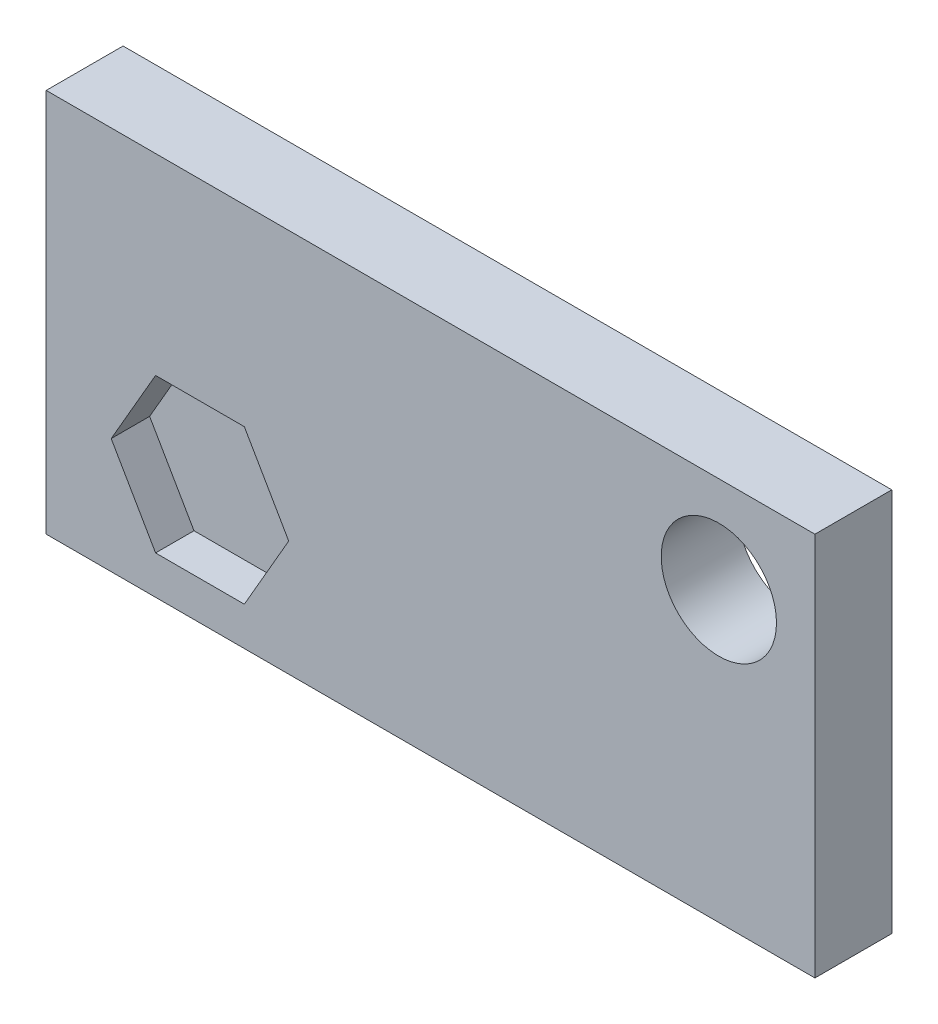
ISO-10303-21;
HEADER;
FILE_DESCRIPTION(('STEP AP214'),'2;1');
FILE_NAME('part.step','',(''),(''),'','','');
FILE_SCHEMA(('AUTOMOTIVE_DESIGN { 1 0 10303 214 1 1 1 1 }'));
ENDSEC;
DATA;
#1=APPLICATION_CONTEXT('core data for automotive mechanical design processes');
#2=APPLICATION_PROTOCOL_DEFINITION('international standard','automotive_design',2000,#1);
#3=PRODUCT_CONTEXT('',#1,'mechanical');
#4=PRODUCT('Part','Part','',(#3));
#5=PRODUCT_RELATED_PRODUCT_CATEGORY('part','',(#4));
#6=PRODUCT_DEFINITION_FORMATION('','',#4);
#7=PRODUCT_DEFINITION_CONTEXT('part definition',#1,'design');
#8=PRODUCT_DEFINITION('design','',#6,#7);
#9=PRODUCT_DEFINITION_SHAPE('','',#8);
#10=(LENGTH_UNIT() NAMED_UNIT(*) SI_UNIT(.MILLI.,.METRE.));
#11=(NAMED_UNIT(*) PLANE_ANGLE_UNIT() SI_UNIT($,.RADIAN.));
#12=(NAMED_UNIT(*) SI_UNIT($,.STERADIAN.) SOLID_ANGLE_UNIT());
#13=UNCERTAINTY_MEASURE_WITH_UNIT(LENGTH_MEASURE(1.E-05),#10,'distance_accuracy_value','');
#14=(GEOMETRIC_REPRESENTATION_CONTEXT(3) GLOBAL_UNCERTAINTY_ASSIGNED_CONTEXT((#13)) GLOBAL_UNIT_ASSIGNED_CONTEXT((#10,
#11,#12)) REPRESENTATION_CONTEXT('',''));
#15=CARTESIAN_POINT('',(0.,0.,0.));
#16=DIRECTION('',(0.,0.,1.));
#17=DIRECTION('',(1.,0.,0.));
#18=AXIS2_PLACEMENT_3D('',#15,#16,#17);
#19=CARTESIAN_POINT('',(0.,0.,10.));
#20=DIRECTION('',(0.,0.,-1.));
#21=DIRECTION('',(-1.,0.,0.));
#22=AXIS2_PLACEMENT_3D('',#19,#20,#21);
#23=PLANE('',#22);
#24=DIRECTION('',(-1.,0.,0.));
#25=VECTOR('',#24,1.);
#26=CARTESIAN_POINT('',(25.7735026918963,25.,10.));
#27=LINE('',#26,#25);
#28=CARTESIAN_POINT('',(25.7735026918963,25.,10.));
#29=VERTEX_POINT('',#28);
#30=CARTESIAN_POINT('',(14.2264973081038,25.,10.));
#31=VERTEX_POINT('',#30);
#32=EDGE_CURVE('E156',#29,#31,#27,.T.);
#33=ORIENTED_EDGE('',*,*,#32,.F.);
#34=DIRECTION('',(-0.5,0.866025403784438,0.));
#35=VECTOR('',#34,1.);
#36=CARTESIAN_POINT('',(31.5470053837925,15.,10.));
#37=LINE('',#36,#35);
#38=CARTESIAN_POINT('',(31.5470053837925,15.,10.));
#39=VERTEX_POINT('',#38);
#40=EDGE_CURVE('E50',#39,#29,#37,.T.);
#41=ORIENTED_EDGE('',*,*,#40,.F.);
#42=DIRECTION('',(0.5,0.866025403784439,0.));
#43=VECTOR('',#42,1.);
#44=CARTESIAN_POINT('',(25.7735026918963,5.00000000000001,10.));
#45=LINE('',#44,#43);
#46=CARTESIAN_POINT('',(25.7735026918963,5.00000000000001,10.));
#47=VERTEX_POINT('',#46);
#48=EDGE_CURVE('E142',#47,#39,#45,.T.);
#49=ORIENTED_EDGE('',*,*,#48,.F.);
#50=DIRECTION('',(1.,0.,0.));
#51=VECTOR('',#50,1.);
#52=CARTESIAN_POINT('',(14.2264973081038,5.00000000000001,10.));
#53=LINE('',#52,#51);
#54=CARTESIAN_POINT('',(14.2264973081038,5.00000000000001,10.));
#55=VERTEX_POINT('',#54);
#56=EDGE_CURVE('E145',#55,#47,#53,.T.);
#57=ORIENTED_EDGE('',*,*,#56,.F.);
#58=DIRECTION('',(0.5,-0.866025403784439,0.));
#59=VECTOR('',#58,1.);
#60=CARTESIAN_POINT('',(8.4529946162075,15.,10.));
#61=LINE('',#60,#59);
#62=CARTESIAN_POINT('',(8.4529946162075,15.,10.));
#63=VERTEX_POINT('',#62);
#64=EDGE_CURVE('E161',#63,#55,#61,.T.);
#65=ORIENTED_EDGE('',*,*,#64,.F.);
#66=DIRECTION('',(-0.5,-0.866025403784439,0.));
#67=VECTOR('',#66,1.);
#68=CARTESIAN_POINT('',(14.2264973081038,25.,10.));
#69=LINE('',#68,#67);
#70=EDGE_CURVE('E158',#31,#63,#69,.T.);
#71=ORIENTED_EDGE('',*,*,#70,.F.);
#72=EDGE_LOOP('',(#33,#41,#49,#57,#65,#71));
#73=FACE_BOUND('',#72,.T.);
#74=DIRECTION('',(0.,-1.,0.));
#75=VECTOR('',#74,1.);
#76=CARTESIAN_POINT('',(0.,0.,10.));
#77=LINE('',#76,#75);
#78=CARTESIAN_POINT('',(0.,50.,10.));
#79=VERTEX_POINT('',#78);
#80=CARTESIAN_POINT('',(0.,0.,10.));
#81=VERTEX_POINT('',#80);
#82=EDGE_CURVE('E182',#79,#81,#77,.T.);
#83=ORIENTED_EDGE('',*,*,#82,.T.);
#84=DIRECTION('',(1.,0.,0.));
#85=VECTOR('',#84,1.);
#86=CARTESIAN_POINT('',(0.,0.,10.));
#87=LINE('',#86,#85);
#88=CARTESIAN_POINT('',(100.,0.,10.));
#89=VERTEX_POINT('',#88);
#90=EDGE_CURVE('E87',#81,#89,#87,.T.);
#91=ORIENTED_EDGE('',*,*,#90,.T.);
#92=DIRECTION('',(0.,1.,0.));
#93=VECTOR('',#92,1.);
#94=CARTESIAN_POINT('',(100.,0.,10.));
#95=LINE('',#94,#93);
#96=CARTESIAN_POINT('',(100.,50.,10.));
#97=VERTEX_POINT('',#96);
#98=EDGE_CURVE('E185',#89,#97,#95,.T.);
#99=ORIENTED_EDGE('',*,*,#98,.T.);
#100=DIRECTION('',(-1.,0.,0.));
#101=VECTOR('',#100,1.);
#102=CARTESIAN_POINT('',(0.,50.,10.));
#103=LINE('',#102,#101);
#104=EDGE_CURVE('E59',#97,#79,#103,.T.);
#105=ORIENTED_EDGE('',*,*,#104,.T.);
#106=EDGE_LOOP('',(#83,#91,#99,#105));
#107=FACE_BOUND('',#106,.T.);
#108=CARTESIAN_POINT('',(87.5,37.5,10.));
#109=DIRECTION('',(0.,0.,1.));
#110=DIRECTION('',(1.,0.,0.));
#111=AXIS2_PLACEMENT_3D('',#108,#109,#110);
#112=CIRCLE('',#111,7.5);
#113=CARTESIAN_POINT('',(95.,37.5,10.));
#114=VERTEX_POINT('',#113);
#115=EDGE_CURVE('E176',#114,#114,#112,.T.);
#116=ORIENTED_EDGE('',*,*,#115,.F.);
#117=EDGE_LOOP('',(#116));
#118=FACE_BOUND('',#117,.T.);
#119=ADVANCED_FACE('F35',(#73,#107,#118),#23,.F.);
#120=CARTESIAN_POINT('',(0.,0.,0.));
#121=DIRECTION('',(0.,0.,-1.));
#122=DIRECTION('',(-1.,0.,0.));
#123=AXIS2_PLACEMENT_3D('',#120,#121,#122);
#124=PLANE('',#123);
#125=DIRECTION('',(0.,-1.,0.));
#126=VECTOR('',#125,1.);
#127=CARTESIAN_POINT('',(0.,0.,0.));
#128=LINE('',#127,#126);
#129=CARTESIAN_POINT('',(0.,50.,0.));
#130=VERTEX_POINT('',#129);
#131=CARTESIAN_POINT('',(0.,0.,0.));
#132=VERTEX_POINT('',#131);
#133=EDGE_CURVE('E179',#130,#132,#128,.T.);
#134=ORIENTED_EDGE('',*,*,#133,.F.);
#135=DIRECTION('',(-1.,0.,0.));
#136=VECTOR('',#135,1.);
#137=CARTESIAN_POINT('',(0.,50.,0.));
#138=LINE('',#137,#136);
#139=CARTESIAN_POINT('',(100.,50.,0.));
#140=VERTEX_POINT('',#139);
#141=EDGE_CURVE('E80',#140,#130,#138,.T.);
#142=ORIENTED_EDGE('',*,*,#141,.F.);
#143=DIRECTION('',(0.,1.,0.));
#144=VECTOR('',#143,1.);
#145=CARTESIAN_POINT('',(100.,0.,0.));
#146=LINE('',#145,#144);
#147=CARTESIAN_POINT('',(100.,0.,0.));
#148=VERTEX_POINT('',#147);
#149=EDGE_CURVE('E193',#148,#140,#146,.T.);
#150=ORIENTED_EDGE('',*,*,#149,.F.);
#151=DIRECTION('',(1.,0.,0.));
#152=VECTOR('',#151,1.);
#153=CARTESIAN_POINT('',(0.,0.,0.));
#154=LINE('',#153,#152);
#155=EDGE_CURVE('E191',#132,#148,#154,.T.);
#156=ORIENTED_EDGE('',*,*,#155,.F.);
#157=EDGE_LOOP('',(#134,#142,#150,#156));
#158=FACE_BOUND('',#157,.T.);
#159=CARTESIAN_POINT('',(87.5,37.5,0.));
#160=DIRECTION('',(0.,0.,1.));
#161=DIRECTION('',(1.,0.,0.));
#162=AXIS2_PLACEMENT_3D('',#159,#160,#161);
#163=CIRCLE('',#162,7.5);
#164=CARTESIAN_POINT('',(95.,37.5,0.));
#165=VERTEX_POINT('',#164);
#166=EDGE_CURVE('E168',#165,#165,#163,.T.);
#167=ORIENTED_EDGE('',*,*,#166,.T.);
#168=EDGE_LOOP('',(#167));
#169=FACE_BOUND('',#168,.T.);
#170=ADVANCED_FACE('F206',(#158,#169),#124,.T.);
#171=CARTESIAN_POINT('',(0.,0.,10.));
#172=DIRECTION('',(1.,0.,0.));
#173=DIRECTION('',(0.,0.,-1.));
#174=AXIS2_PLACEMENT_3D('',#171,#172,#173);
#175=PLANE('',#174);
#176=ORIENTED_EDGE('',*,*,#133,.T.);
#177=DIRECTION('',(0.,0.,-1.));
#178=VECTOR('',#177,1.);
#179=CARTESIAN_POINT('',(0.,0.,10.));
#180=LINE('',#179,#178);
#181=EDGE_CURVE('E11',#81,#132,#180,.T.);
#182=ORIENTED_EDGE('',*,*,#181,.F.);
#183=ORIENTED_EDGE('',*,*,#82,.F.);
#184=DIRECTION('',(0.,0.,-1.));
#185=VECTOR('',#184,1.);
#186=CARTESIAN_POINT('',(0.,50.,10.));
#187=LINE('',#186,#185);
#188=EDGE_CURVE('E188',#79,#130,#187,.T.);
#189=ORIENTED_EDGE('',*,*,#188,.T.);
#190=EDGE_LOOP('',(#176,#182,#183,#189));
#191=FACE_BOUND('',#190,.T.);
#192=ADVANCED_FACE('F37',(#191),#175,.F.);
#193=CARTESIAN_POINT('',(0.,0.,10.));
#194=DIRECTION('',(0.,1.,0.));
#195=DIRECTION('',(0.,0.,1.));
#196=AXIS2_PLACEMENT_3D('',#193,#194,#195);
#197=PLANE('',#196);
#198=ORIENTED_EDGE('',*,*,#155,.T.);
#199=DIRECTION('',(0.,0.,-1.));
#200=VECTOR('',#199,1.);
#201=CARTESIAN_POINT('',(100.,0.,10.));
#202=LINE('',#201,#200);
#203=EDGE_CURVE('E43',#89,#148,#202,.T.);
#204=ORIENTED_EDGE('',*,*,#203,.F.);
#205=ORIENTED_EDGE('',*,*,#90,.F.);
#206=ORIENTED_EDGE('',*,*,#181,.T.);
#207=EDGE_LOOP('',(#198,#204,#205,#206));
#208=FACE_BOUND('',#207,.T.);
#209=ADVANCED_FACE('F221',(#208),#197,.F.);
#210=CARTESIAN_POINT('',(100.,0.,10.));
#211=DIRECTION('',(-1.,0.,0.));
#212=DIRECTION('',(0.,-1.,0.));
#213=AXIS2_PLACEMENT_3D('',#210,#211,#212);
#214=PLANE('',#213);
#215=ORIENTED_EDGE('',*,*,#149,.T.);
#216=DIRECTION('',(0.,0.,-1.));
#217=VECTOR('',#216,1.);
#218=CARTESIAN_POINT('',(100.,50.,10.));
#219=LINE('',#218,#217);
#220=EDGE_CURVE('E197',#97,#140,#219,.T.);
#221=ORIENTED_EDGE('',*,*,#220,.F.);
#222=ORIENTED_EDGE('',*,*,#98,.F.);
#223=ORIENTED_EDGE('',*,*,#203,.T.);
#224=EDGE_LOOP('',(#215,#221,#222,#223));
#225=FACE_BOUND('',#224,.T.);
#226=ADVANCED_FACE('F202',(#225),#214,.F.);
#227=CARTESIAN_POINT('',(0.,50.,10.));
#228=DIRECTION('',(0.,-1.,0.));
#229=DIRECTION('',(0.,0.,-1.));
#230=AXIS2_PLACEMENT_3D('',#227,#228,#229);
#231=PLANE('',#230);
#232=ORIENTED_EDGE('',*,*,#141,.T.);
#233=ORIENTED_EDGE('',*,*,#188,.F.);
#234=ORIENTED_EDGE('',*,*,#104,.F.);
#235=ORIENTED_EDGE('',*,*,#220,.T.);
#236=EDGE_LOOP('',(#232,#233,#234,#235));
#237=FACE_BOUND('',#236,.T.);
#238=ADVANCED_FACE('F211',(#237),#231,.F.);
#239=CARTESIAN_POINT('',(87.5,37.5,10.));
#240=DIRECTION('',(0.,0.,-1.));
#241=DIRECTION('',(-1.,0.,0.));
#242=AXIS2_PLACEMENT_3D('',#239,#240,#241);
#243=CYLINDRICAL_SURFACE('',#242,7.5);
#244=ORIENTED_EDGE('',*,*,#115,.T.);
#245=EDGE_LOOP('',(#244));
#246=FACE_BOUND('',#245,.T.);
#247=ORIENTED_EDGE('',*,*,#166,.F.);
#248=EDGE_LOOP('',(#247));
#249=FACE_BOUND('',#248,.T.);
#250=ADVANCED_FACE('F213',(#246,#249),#243,.F.);
#251=CARTESIAN_POINT('',(31.5470053837925,15.,5.));
#252=DIRECTION('',(0.866025403784438,0.5,0.));
#253=DIRECTION('',(-0.5,0.866025403784439,0.));
#254=AXIS2_PLACEMENT_3D('',#251,#252,#253);
#255=PLANE('',#254);
#256=ORIENTED_EDGE('',*,*,#40,.T.);
#257=DIRECTION('',(0.,0.,1.));
#258=VECTOR('',#257,1.);
#259=CARTESIAN_POINT('',(25.7735026918963,25.,5.));
#260=LINE('',#259,#258);
#261=CARTESIAN_POINT('',(25.7735026918963,25.,5.));
#262=VERTEX_POINT('',#261);
#263=EDGE_CURVE('E119',#262,#29,#260,.T.);
#264=ORIENTED_EDGE('',*,*,#263,.F.);
#265=DIRECTION('',(-0.5,0.866025403784438,0.));
#266=VECTOR('',#265,1.);
#267=CARTESIAN_POINT('',(31.5470053837925,15.,5.));
#268=LINE('',#267,#266);
#269=CARTESIAN_POINT('',(31.5470053837925,15.,5.));
#270=VERTEX_POINT('',#269);
#271=EDGE_CURVE('E123',#270,#262,#268,.T.);
#272=ORIENTED_EDGE('',*,*,#271,.F.);
#273=DIRECTION('',(0.,0.,1.));
#274=VECTOR('',#273,1.);
#275=CARTESIAN_POINT('',(31.5470053837925,15.,5.));
#276=LINE('',#275,#274);
#277=EDGE_CURVE('E166',#270,#39,#276,.T.);
#278=ORIENTED_EDGE('',*,*,#277,.T.);
#279=EDGE_LOOP('',(#256,#264,#272,#278));
#280=FACE_BOUND('',#279,.T.);
#281=ADVANCED_FACE('F121',(#280),#255,.F.);
#282=CARTESIAN_POINT('',(25.7735026918963,5.00000000000001,5.));
#283=DIRECTION('',(0.866025403784439,-0.5,0.));
#284=DIRECTION('',(0.5,0.866025403784439,0.));
#285=AXIS2_PLACEMENT_3D('',#282,#283,#284);
#286=PLANE('',#285);
#287=ORIENTED_EDGE('',*,*,#48,.T.);
#288=ORIENTED_EDGE('',*,*,#277,.F.);
#289=DIRECTION('',(0.5,0.866025403784439,0.));
#290=VECTOR('',#289,1.);
#291=CARTESIAN_POINT('',(25.7735026918963,5.00000000000001,5.));
#292=LINE('',#291,#290);
#293=CARTESIAN_POINT('',(25.7735026918963,5.00000000000001,5.));
#294=VERTEX_POINT('',#293);
#295=EDGE_CURVE('E129',#294,#270,#292,.T.);
#296=ORIENTED_EDGE('',*,*,#295,.F.);
#297=DIRECTION('',(0.,0.,1.));
#298=VECTOR('',#297,1.);
#299=CARTESIAN_POINT('',(25.7735026918963,5.00000000000001,5.));
#300=LINE('',#299,#298);
#301=EDGE_CURVE('E169',#294,#47,#300,.T.);
#302=ORIENTED_EDGE('',*,*,#301,.T.);
#303=EDGE_LOOP('',(#287,#288,#296,#302));
#304=FACE_BOUND('',#303,.T.);
#305=ADVANCED_FACE('F233',(#304),#286,.F.);
#306=CARTESIAN_POINT('',(14.2264973081038,5.00000000000001,5.));
#307=DIRECTION('',(0.,-1.,0.));
#308=DIRECTION('',(1.,0.,0.));
#309=AXIS2_PLACEMENT_3D('',#306,#307,#308);
#310=PLANE('',#309);
#311=ORIENTED_EDGE('',*,*,#56,.T.);
#312=ORIENTED_EDGE('',*,*,#301,.F.);
#313=DIRECTION('',(1.,0.,0.));
#314=VECTOR('',#313,1.);
#315=CARTESIAN_POINT('',(14.2264973081038,5.00000000000001,5.));
#316=LINE('',#315,#314);
#317=CARTESIAN_POINT('',(14.2264973081038,5.00000000000001,5.));
#318=VERTEX_POINT('',#317);
#319=EDGE_CURVE('E152',#318,#294,#316,.T.);
#320=ORIENTED_EDGE('',*,*,#319,.F.);
#321=DIRECTION('',(0.,0.,1.));
#322=VECTOR('',#321,1.);
#323=CARTESIAN_POINT('',(14.2264973081038,5.00000000000001,5.));
#324=LINE('',#323,#322);
#325=EDGE_CURVE('E171',#318,#55,#324,.T.);
#326=ORIENTED_EDGE('',*,*,#325,.T.);
#327=EDGE_LOOP('',(#311,#312,#320,#326));
#328=FACE_BOUND('',#327,.T.);
#329=ADVANCED_FACE('F243',(#328),#310,.F.);
#330=CARTESIAN_POINT('',(8.4529946162075,15.,5.));
#331=DIRECTION('',(-0.866025403784438,-0.5,0.));
#332=DIRECTION('',(0.5,-0.866025403784439,0.));
#333=AXIS2_PLACEMENT_3D('',#330,#331,#332);
#334=PLANE('',#333);
#335=ORIENTED_EDGE('',*,*,#64,.T.);
#336=ORIENTED_EDGE('',*,*,#325,.F.);
#337=DIRECTION('',(0.5,-0.866025403784439,0.));
#338=VECTOR('',#337,1.);
#339=CARTESIAN_POINT('',(8.4529946162075,15.,5.));
#340=LINE('',#339,#338);
#341=CARTESIAN_POINT('',(8.4529946162075,15.,5.));
#342=VERTEX_POINT('',#341);
#343=EDGE_CURVE('E149',#342,#318,#340,.T.);
#344=ORIENTED_EDGE('',*,*,#343,.F.);
#345=DIRECTION('',(0.,0.,1.));
#346=VECTOR('',#345,1.);
#347=CARTESIAN_POINT('',(8.4529946162075,15.,5.));
#348=LINE('',#347,#346);
#349=EDGE_CURVE('E173',#342,#63,#348,.T.);
#350=ORIENTED_EDGE('',*,*,#349,.T.);
#351=EDGE_LOOP('',(#335,#336,#344,#350));
#352=FACE_BOUND('',#351,.T.);
#353=ADVANCED_FACE('F239',(#352),#334,.F.);
#354=CARTESIAN_POINT('',(14.2264973081038,25.,5.));
#355=DIRECTION('',(-0.866025403784439,0.5,0.));
#356=DIRECTION('',(-0.5,-0.866025403784439,0.));
#357=AXIS2_PLACEMENT_3D('',#354,#355,#356);
#358=PLANE('',#357);
#359=ORIENTED_EDGE('',*,*,#70,.T.);
#360=ORIENTED_EDGE('',*,*,#349,.F.);
#361=DIRECTION('',(-0.5,-0.866025403784439,0.));
#362=VECTOR('',#361,1.);
#363=CARTESIAN_POINT('',(14.2264973081038,25.,5.));
#364=LINE('',#363,#362);
#365=CARTESIAN_POINT('',(14.2264973081038,25.,5.));
#366=VERTEX_POINT('',#365);
#367=EDGE_CURVE('E137',#366,#342,#364,.T.);
#368=ORIENTED_EDGE('',*,*,#367,.F.);
#369=DIRECTION('',(0.,0.,1.));
#370=VECTOR('',#369,1.);
#371=CARTESIAN_POINT('',(14.2264973081038,25.,5.));
#372=LINE('',#371,#370);
#373=EDGE_CURVE('E128',#366,#31,#372,.T.);
#374=ORIENTED_EDGE('',*,*,#373,.T.);
#375=EDGE_LOOP('',(#359,#360,#368,#374));
#376=FACE_BOUND('',#375,.T.);
#377=ADVANCED_FACE('F236',(#376),#358,.F.);
#378=CARTESIAN_POINT('',(25.7735026918963,25.,5.));
#379=DIRECTION('',(0.,1.,0.));
#380=DIRECTION('',(0.,0.,1.));
#381=AXIS2_PLACEMENT_3D('',#378,#379,#380);
#382=PLANE('',#381);
#383=ORIENTED_EDGE('',*,*,#32,.T.);
#384=ORIENTED_EDGE('',*,*,#373,.F.);
#385=DIRECTION('',(-1.,0.,0.));
#386=VECTOR('',#385,1.);
#387=CARTESIAN_POINT('',(25.7735026918963,25.,5.));
#388=LINE('',#387,#386);
#389=EDGE_CURVE('E132',#262,#366,#388,.T.);
#390=ORIENTED_EDGE('',*,*,#389,.F.);
#391=ORIENTED_EDGE('',*,*,#263,.T.);
#392=EDGE_LOOP('',(#383,#384,#390,#391));
#393=FACE_BOUND('',#392,.T.);
#394=ADVANCED_FACE('F133',(#393),#382,.F.);
#395=CARTESIAN_POINT('',(0.,0.,5.));
#396=DIRECTION('',(0.,0.,1.));
#397=DIRECTION('',(1.,0.,0.));
#398=AXIS2_PLACEMENT_3D('',#395,#396,#397);
#399=PLANE('',#398);
#400=ORIENTED_EDGE('',*,*,#271,.T.);
#401=ORIENTED_EDGE('',*,*,#389,.T.);
#402=ORIENTED_EDGE('',*,*,#367,.T.);
#403=ORIENTED_EDGE('',*,*,#343,.T.);
#404=ORIENTED_EDGE('',*,*,#319,.T.);
#405=ORIENTED_EDGE('',*,*,#295,.T.);
#406=EDGE_LOOP('',(#400,#401,#402,#403,#404,#405));
#407=FACE_BOUND('',#406,.T.);
#408=ADVANCED_FACE('F139',(#407),#399,.T.);
#409=CLOSED_SHELL('',(#119,#170,#192,#209,#226,#238,#250,#281,#305,#329,#353,#377,#394,#408));
#410=MANIFOLD_SOLID_BREP('B2',#409);
#411=ADVANCED_BREP_SHAPE_REPRESENTATION('',(#18,#410),#14);
#412=SHAPE_DEFINITION_REPRESENTATION(#9,#411);
ENDSEC;
END-ISO-10303-21;
